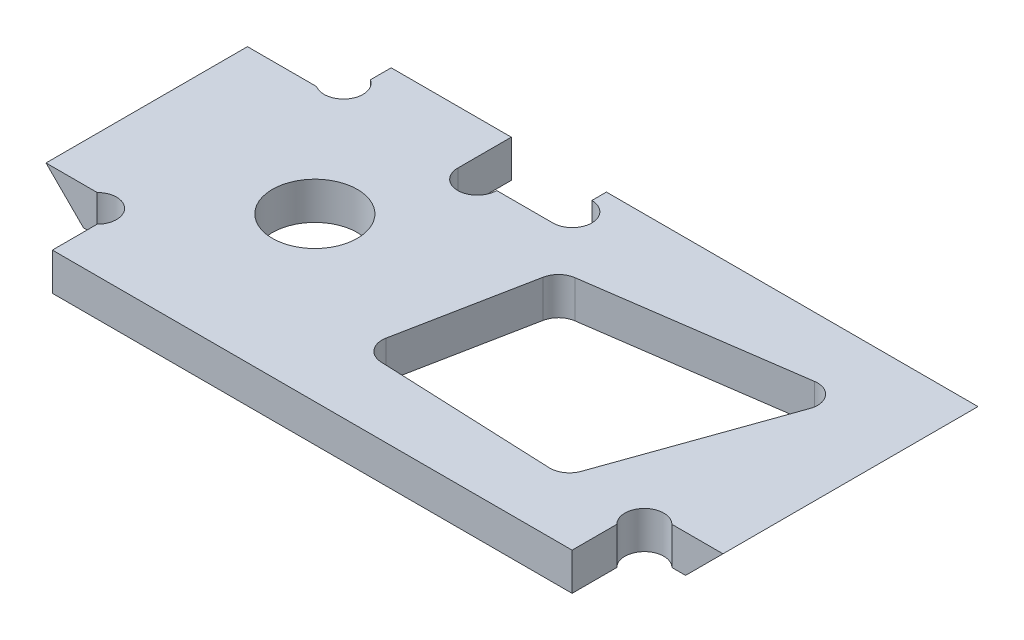
ISO-10303-21;
HEADER;
FILE_DESCRIPTION(('STEP AP214'),'2;1');
FILE_NAME('part.step','',(''),(''),'','','');
FILE_SCHEMA(('AUTOMOTIVE_DESIGN { 1 0 10303 214 1 1 1 1 }'));
ENDSEC;
DATA;
#1=APPLICATION_CONTEXT('core data for automotive mechanical design processes');
#2=APPLICATION_PROTOCOL_DEFINITION('international standard','automotive_design',2000,#1);
#3=PRODUCT_CONTEXT('',#1,'mechanical');
#4=PRODUCT('Part','Part','',(#3));
#5=PRODUCT_RELATED_PRODUCT_CATEGORY('part','',(#4));
#6=PRODUCT_DEFINITION_FORMATION('','',#4);
#7=PRODUCT_DEFINITION_CONTEXT('part definition',#1,'design');
#8=PRODUCT_DEFINITION('design','',#6,#7);
#9=PRODUCT_DEFINITION_SHAPE('','',#8);
#10=(LENGTH_UNIT() NAMED_UNIT(*) SI_UNIT(.MILLI.,.METRE.));
#11=(NAMED_UNIT(*) PLANE_ANGLE_UNIT() SI_UNIT($,.RADIAN.));
#12=(NAMED_UNIT(*) SI_UNIT($,.STERADIAN.) SOLID_ANGLE_UNIT());
#13=UNCERTAINTY_MEASURE_WITH_UNIT(LENGTH_MEASURE(1.E-05),#10,'distance_accuracy_value','');
#14=(GEOMETRIC_REPRESENTATION_CONTEXT(3) GLOBAL_UNCERTAINTY_ASSIGNED_CONTEXT((#13)) GLOBAL_UNIT_ASSIGNED_CONTEXT((#10,
#11,#12)) REPRESENTATION_CONTEXT('',''));
#15=CARTESIAN_POINT('',(0.,0.,0.));
#16=DIRECTION('',(0.,0.,1.));
#17=DIRECTION('',(1.,0.,0.));
#18=AXIS2_PLACEMENT_3D('',#15,#16,#17);
#19=CARTESIAN_POINT('',(-114.808,12.7,-77.1308478006368));
#20=DIRECTION('',(0.,0.,1.));
#21=DIRECTION('',(1.,0.,0.));
#22=AXIS2_PLACEMENT_3D('',#19,#20,#21);
#23=PLANE('',#22);
#24=DIRECTION('',(-1.,0.,0.));
#25=VECTOR('',#24,1.);
#26=CARTESIAN_POINT('',(-114.808,0.,-77.1308478006368));
#27=LINE('',#26,#25);
#28=CARTESIAN_POINT('',(102.108,0.,-77.1308478006368));
#29=VERTEX_POINT('',#28);
#30=CARTESIAN_POINT('',(-11.2199686031738,0.,-77.1308478006368));
#31=VERTEX_POINT('',#30);
#32=EDGE_CURVE('E413',#29,#31,#27,.T.);
#33=ORIENTED_EDGE('',*,*,#32,.T.);
#34=DIRECTION('',(0.,-1.,0.));
#35=VECTOR('',#34,1.);
#36=CARTESIAN_POINT('',(-11.2199686031738,12.7,-77.1308478006368));
#37=LINE('',#36,#35);
#38=CARTESIAN_POINT('',(-11.2199686031738,12.7,-77.1308478006368));
#39=VERTEX_POINT('',#38);
#40=EDGE_CURVE('E268',#39,#31,#37,.T.);
#41=ORIENTED_EDGE('',*,*,#40,.F.);
#42=DIRECTION('',(-1.,0.,0.));
#43=VECTOR('',#42,1.);
#44=CARTESIAN_POINT('',(-114.808,12.7,-77.1308478006368));
#45=LINE('',#44,#43);
#46=CARTESIAN_POINT('',(114.808,12.7,-77.1308478006368));
#47=VERTEX_POINT('',#46);
#48=EDGE_CURVE('E419',#47,#39,#45,.T.);
#49=ORIENTED_EDGE('',*,*,#48,.F.);
#50=DIRECTION('',(0.707106781186549,0.707106781186546,0.));
#51=VECTOR('',#50,1.);
#52=CARTESIAN_POINT('',(-4.02455846426619E-13,-102.108,-77.1308478006368));
#53=LINE('',#52,#51);
#54=EDGE_CURVE('E422',#47,#29,#53,.F.);
#55=ORIENTED_EDGE('',*,*,#54,.T.);
#56=EDGE_LOOP('',(#33,#41,#49,#55));
#57=FACE_BOUND('',#56,.T.);
#58=ADVANCED_FACE('F39',(#57),#23,.F.);
#59=CARTESIAN_POINT('',(-114.808,12.7,-77.1308478006368));
#60=DIRECTION('',(-0.707106781186546,-0.707106781186549,0.));
#61=DIRECTION('',(0.707106781186549,-0.707106781186546,0.));
#62=AXIS2_PLACEMENT_3D('',#59,#60,#61);
#63=PLANE('',#62);
#64=DIRECTION('',(0.,0.,1.));
#65=VECTOR('',#64,1.);
#66=CARTESIAN_POINT('',(-114.808,12.7,-77.1308478006368));
#67=LINE('',#66,#65);
#68=CARTESIAN_POINT('',(-114.808,12.7,-58.9698478006368));
#69=VERTEX_POINT('',#68);
#70=CARTESIAN_POINT('',(-114.808,12.7,9.35615219936411));
#71=VERTEX_POINT('',#70);
#72=EDGE_CURVE('E409',#69,#71,#67,.T.);
#73=ORIENTED_EDGE('',*,*,#72,.F.);
#74=DIRECTION('',(-0.707106781186549,0.707106781186546,0.));
#75=VECTOR('',#74,1.);
#76=CARTESIAN_POINT('',(-114.808,12.7,-58.9698478006368));
#77=LINE('',#76,#75);
#78=CARTESIAN_POINT('',(-102.108,0.,-58.9698478006368));
#79=VERTEX_POINT('',#78);
#80=EDGE_CURVE('E405',#69,#79,#77,.F.);
#81=ORIENTED_EDGE('',*,*,#80,.T.);
#82=DIRECTION('',(0.,0.,-1.));
#83=VECTOR('',#82,1.);
#84=CARTESIAN_POINT('',(-102.108,0.,-77.1308478006368));
#85=LINE('',#84,#83);
#86=CARTESIAN_POINT('',(-102.108,0.,9.35615219936411));
#87=VERTEX_POINT('',#86);
#88=EDGE_CURVE('E408',#79,#87,#85,.F.);
#89=ORIENTED_EDGE('',*,*,#88,.T.);
#90=DIRECTION('',(0.707106781186549,-0.707106781186546,0.));
#91=VECTOR('',#90,1.);
#92=CARTESIAN_POINT('',(-114.808,12.7,9.35615219936411));
#93=LINE('',#92,#91);
#94=EDGE_CURVE('E396',#87,#71,#93,.F.);
#95=ORIENTED_EDGE('',*,*,#94,.T.);
#96=EDGE_LOOP('',(#73,#81,#89,#95));
#97=FACE_BOUND('',#96,.T.);
#98=ADVANCED_FACE('F473',(#97),#63,.T.);
#99=CARTESIAN_POINT('',(-114.808,12.7,33.8671521993641));
#100=DIRECTION('',(0.,0.,-1.));
#101=DIRECTION('',(-1.,0.,0.));
#102=AXIS2_PLACEMENT_3D('',#99,#100,#101);
#103=PLANE('',#102);
#104=DIRECTION('',(1.,0.,0.));
#105=VECTOR('',#104,1.);
#106=CARTESIAN_POINT('',(-114.808,0.,33.8671521993641));
#107=LINE('',#106,#105);
#108=CARTESIAN_POINT('',(-88.138,0.,33.8671521993641));
#109=VERTEX_POINT('',#108);
#110=CARTESIAN_POINT('',(88.138,0.,33.8671521993641));
#111=VERTEX_POINT('',#110);
#112=EDGE_CURVE('E423',#109,#111,#107,.T.);
#113=ORIENTED_EDGE('',*,*,#112,.T.);
#114=DIRECTION('',(0.,1.,0.));
#115=VECTOR('',#114,1.);
#116=CARTESIAN_POINT('',(88.138,0.,33.8671521993641));
#117=LINE('',#116,#115);
#118=CARTESIAN_POINT('',(88.138,12.7,33.8671521993641));
#119=VERTEX_POINT('',#118);
#120=EDGE_CURVE('E337',#111,#119,#117,.T.);
#121=ORIENTED_EDGE('',*,*,#120,.T.);
#122=DIRECTION('',(1.,0.,0.));
#123=VECTOR('',#122,1.);
#124=CARTESIAN_POINT('',(-114.808,12.7,33.8671521993641));
#125=LINE('',#124,#123);
#126=CARTESIAN_POINT('',(-88.138,12.7,33.8671521993641));
#127=VERTEX_POINT('',#126);
#128=EDGE_CURVE('E412',#127,#119,#125,.T.);
#129=ORIENTED_EDGE('',*,*,#128,.F.);
#130=DIRECTION('',(0.,1.,0.));
#131=VECTOR('',#130,1.);
#132=CARTESIAN_POINT('',(-88.138,0.,33.8671521993641));
#133=LINE('',#132,#131);
#134=EDGE_CURVE('E387',#109,#127,#133,.T.);
#135=ORIENTED_EDGE('',*,*,#134,.F.);
#136=EDGE_LOOP('',(#113,#121,#129,#135));
#137=FACE_BOUND('',#136,.T.);
#138=ADVANCED_FACE('F458',(#137),#103,.F.);
#139=CARTESIAN_POINT('',(114.808,12.7,-77.1308478006368));
#140=DIRECTION('',(0.707106781186546,-0.707106781186549,0.));
#141=DIRECTION('',(0.707106781186549,0.707106781186546,0.));
#142=AXIS2_PLACEMENT_3D('',#139,#140,#141);
#143=PLANE('',#142);
#144=DIRECTION('',(0.,0.,-1.));
#145=VECTOR('',#144,1.);
#146=CARTESIAN_POINT('',(114.808,12.7,-77.1308478006368));
#147=LINE('',#146,#145);
#148=CARTESIAN_POINT('',(114.808,12.7,9.35615219936409));
#149=VERTEX_POINT('',#148);
#150=EDGE_CURVE('E416',#149,#47,#147,.T.);
#151=ORIENTED_EDGE('',*,*,#150,.F.);
#152=DIRECTION('',(0.707106781186549,0.707106781186546,0.));
#153=VECTOR('',#152,1.);
#154=CARTESIAN_POINT('',(114.808,12.7,9.35615219936409));
#155=LINE('',#154,#153);
#156=CARTESIAN_POINT('',(102.108,0.,9.35615219936409));
#157=VERTEX_POINT('',#156);
#158=EDGE_CURVE('E402',#149,#157,#155,.F.);
#159=ORIENTED_EDGE('',*,*,#158,.T.);
#160=DIRECTION('',(0.,0.,1.));
#161=VECTOR('',#160,1.);
#162=CARTESIAN_POINT('',(102.108,0.,-77.1308478006368));
#163=LINE('',#162,#161);
#164=EDGE_CURVE('E426',#157,#29,#163,.F.);
#165=ORIENTED_EDGE('',*,*,#164,.T.);
#166=ORIENTED_EDGE('',*,*,#54,.F.);
#167=EDGE_LOOP('',(#151,#159,#165,#166));
#168=FACE_BOUND('',#167,.T.);
#169=ADVANCED_FACE('F41',(#168),#143,.T.);
#170=CARTESIAN_POINT('',(-43.4779686031738,12.7,-77.1308478006368));
#171=VERTEX_POINT('',#170);
#172=CARTESIAN_POINT('',(-84.2245851126541,12.7,-77.1308478006368));
#173=VERTEX_POINT('',#172);
#174=EDGE_CURVE('E418',#171,#173,#45,.T.);
#175=ORIENTED_EDGE('',*,*,#174,.F.);
#176=DIRECTION('',(0.,-1.,0.));
#177=VECTOR('',#176,1.);
#178=CARTESIAN_POINT('',(-43.4779686031738,12.7,-77.1308478006368));
#179=LINE('',#178,#177);
#180=CARTESIAN_POINT('',(-43.4779686031738,0.,-77.1308478006368));
#181=VERTEX_POINT('',#180);
#182=EDGE_CURVE('E224',#171,#181,#179,.T.);
#183=ORIENTED_EDGE('',*,*,#182,.T.);
#184=CARTESIAN_POINT('',(-84.2245851126541,0.,-77.1308478006368));
#185=VERTEX_POINT('',#184);
#186=EDGE_CURVE('E429',#181,#185,#27,.T.);
#187=ORIENTED_EDGE('',*,*,#186,.T.);
#188=DIRECTION('',(0.,1.,0.));
#189=VECTOR('',#188,1.);
#190=CARTESIAN_POINT('',(-84.2245851126541,0.,-77.1308478006368));
#191=LINE('',#190,#189);
#192=EDGE_CURVE('E320',#185,#173,#191,.T.);
#193=ORIENTED_EDGE('',*,*,#192,.T.);
#194=EDGE_LOOP('',(#175,#183,#187,#193));
#195=FACE_BOUND('',#194,.T.);
#196=ADVANCED_FACE('F488',(#195),#23,.F.);
#197=CARTESIAN_POINT('',(0.,12.7,0.));
#198=DIRECTION('',(0.,1.,0.));
#199=DIRECTION('',(0.,0.,1.));
#200=AXIS2_PLACEMENT_3D('',#197,#198,#199);
#201=PLANE('',#200);
#202=CARTESIAN_POINT('',(-54.2628101997534,12.7,-21.2860980461469));
#203=DIRECTION('',(0.,-1.,0.));
#204=DIRECTION('',(0.,0.,-1.));
#205=AXIS2_PLACEMENT_3D('',#202,#203,#204);
#206=CIRCLE('',#205,14.4061242384659);
#207=CARTESIAN_POINT('',(-54.2628101997534,12.7,-35.6922222846128));
#208=VERTEX_POINT('',#207);
#209=EDGE_CURVE('E255',#208,#208,#206,.T.);
#210=ORIENTED_EDGE('',*,*,#209,.T.);
#211=EDGE_LOOP('',(#210));
#212=FACE_BOUND('',#211,.T.);
#213=DIRECTION('',(0.,0.,1.));
#214=VECTOR('',#213,1.);
#215=CARTESIAN_POINT('',(-11.2199686031738,12.7,-77.1308478006368));
#216=LINE('',#215,#214);
#217=CARTESIAN_POINT('',(-11.2199686031738,12.7,-72.1778478006368));
#218=VERTEX_POINT('',#217);
#219=EDGE_CURVE('E233',#39,#218,#216,.T.);
#220=ORIENTED_EDGE('',*,*,#219,.T.);
#221=CARTESIAN_POINT('',(-11.2199686031738,12.7,-65.5738478006368));
#222=DIRECTION('',(0.,-1.,0.));
#223=DIRECTION('',(0.,0.,1.));
#224=AXIS2_PLACEMENT_3D('',#221,#222,#223);
#225=CIRCLE('',#224,6.604);
#226=CARTESIAN_POINT('',(-11.2199686031738,12.7,-58.9698478006368));
#227=VERTEX_POINT('',#226);
#228=EDGE_CURVE('E250',#218,#227,#225,.T.);
#229=ORIENTED_EDGE('',*,*,#228,.T.);
#230=DIRECTION('',(-1.,0.,0.));
#231=VECTOR('',#230,1.);
#232=CARTESIAN_POINT('',(-11.2199686031738,12.7,-58.9698478006368));
#233=LINE('',#232,#231);
#234=CARTESIAN_POINT('',(-30.2699686031738,12.7,-58.9698478006368));
#235=VERTEX_POINT('',#234);
#236=EDGE_CURVE('E225',#227,#235,#233,.T.);
#237=ORIENTED_EDGE('',*,*,#236,.T.);
#238=CARTESIAN_POINT('',(-36.8739686031738,12.7,-58.9698478006368));
#239=DIRECTION('',(0.,-1.,0.));
#240=DIRECTION('',(0.,0.,1.));
#241=AXIS2_PLACEMENT_3D('',#238,#239,#240);
#242=CIRCLE('',#241,6.60400000000001);
#243=CARTESIAN_POINT('',(-43.4779686031738,12.7,-58.9698478006368));
#244=VERTEX_POINT('',#243);
#245=EDGE_CURVE('E220',#235,#244,#242,.T.);
#246=ORIENTED_EDGE('',*,*,#245,.T.);
#247=DIRECTION('',(0.,0.,-1.));
#248=VECTOR('',#247,1.);
#249=CARTESIAN_POINT('',(-43.4779686031738,12.7,-77.1308478006368));
#250=LINE('',#249,#248);
#251=EDGE_CURVE('E228',#244,#171,#250,.T.);
#252=ORIENTED_EDGE('',*,*,#251,.T.);
#253=ORIENTED_EDGE('',*,*,#174,.T.);
#254=DIRECTION('',(0.,0.,-1.));
#255=VECTOR('',#254,1.);
#256=CARTESIAN_POINT('',(-84.2245851126541,12.7,-70.0995701691418));
#257=LINE('',#256,#255);
#258=CARTESIAN_POINT('',(-84.2245851126541,12.7,-70.0995701691418));
#259=VERTEX_POINT('',#258);
#260=EDGE_CURVE('E364',#259,#173,#257,.T.);
#261=ORIENTED_EDGE('',*,*,#260,.F.);
#262=CARTESIAN_POINT('',(-87.7805851126541,12.7,-64.5347089848893));
#263=DIRECTION('',(0.,1.,0.));
#264=DIRECTION('',(0.,0.,1.));
#265=AXIS2_PLACEMENT_3D('',#262,#263,#264);
#266=CIRCLE('',#265,6.60399999999999);
#267=CARTESIAN_POINT('',(-91.3365851126541,12.7,-58.9698478006368));
#268=VERTEX_POINT('',#267);
#269=EDGE_CURVE('E367',#268,#259,#266,.T.);
#270=ORIENTED_EDGE('',*,*,#269,.F.);
#271=DIRECTION('',(1.,0.,0.));
#272=VECTOR('',#271,1.);
#273=CARTESIAN_POINT('',(-114.808,12.7,-58.9698478006368));
#274=LINE('',#273,#272);
#275=EDGE_CURVE('E342',#69,#268,#274,.T.);
#276=ORIENTED_EDGE('',*,*,#275,.F.);
#277=ORIENTED_EDGE('',*,*,#72,.T.);
#278=DIRECTION('',(-1.,0.,0.));
#279=VECTOR('',#278,1.);
#280=CARTESIAN_POINT('',(-114.808,12.7,9.35615219936411));
#281=LINE('',#280,#279);
#282=CARTESIAN_POINT('',(-97.4774663659119,12.7,9.35615219936411));
#283=VERTEX_POINT('',#282);
#284=EDGE_CURVE('E381',#283,#71,#281,.T.);
#285=ORIENTED_EDGE('',*,*,#284,.F.);
#286=CARTESIAN_POINT('',(-92.807733182956,12.7,14.0258853823201));
#287=DIRECTION('',(0.,1.,0.));
#288=DIRECTION('',(0.,0.,1.));
#289=AXIS2_PLACEMENT_3D('',#286,#287,#288);
#290=CIRCLE('',#289,6.60400000000001);
#291=CARTESIAN_POINT('',(-88.138,12.7,18.695618565276));
#292=VERTEX_POINT('',#291);
#293=EDGE_CURVE('E390',#292,#283,#290,.T.);
#294=ORIENTED_EDGE('',*,*,#293,.F.);
#295=DIRECTION('',(0.,0.,-1.));
#296=VECTOR('',#295,1.);
#297=CARTESIAN_POINT('',(-88.138,12.7,18.695618565276));
#298=LINE('',#297,#296);
#299=EDGE_CURVE('E352',#127,#292,#298,.T.);
#300=ORIENTED_EDGE('',*,*,#299,.F.);
#301=ORIENTED_EDGE('',*,*,#128,.T.);
#302=DIRECTION('',(0.,0.,1.));
#303=VECTOR('',#302,1.);
#304=CARTESIAN_POINT('',(88.138,12.7,18.695618565276));
#305=LINE('',#304,#303);
#306=CARTESIAN_POINT('',(88.138,12.7,18.695618565276));
#307=VERTEX_POINT('',#306);
#308=EDGE_CURVE('E346',#307,#119,#305,.T.);
#309=ORIENTED_EDGE('',*,*,#308,.F.);
#310=CARTESIAN_POINT('',(92.807733182956,12.7,14.02588538232));
#311=DIRECTION('',(0.,1.,0.));
#312=DIRECTION('',(0.,0.,-1.));
#313=AXIS2_PLACEMENT_3D('',#310,#311,#312);
#314=CIRCLE('',#313,6.60400000000001);
#315=CARTESIAN_POINT('',(97.477466365912,12.7,9.35615219936409));
#316=VERTEX_POINT('',#315);
#317=EDGE_CURVE('E349',#316,#307,#314,.T.);
#318=ORIENTED_EDGE('',*,*,#317,.F.);
#319=DIRECTION('',(-1.,0.,0.));
#320=VECTOR('',#319,1.);
#321=CARTESIAN_POINT('',(114.808,12.7,9.35615219936409));
#322=LINE('',#321,#320);
#323=EDGE_CURVE('E343',#149,#316,#322,.T.);
#324=ORIENTED_EDGE('',*,*,#323,.F.);
#325=ORIENTED_EDGE('',*,*,#150,.T.);
#326=ORIENTED_EDGE('',*,*,#48,.T.);
#327=EDGE_LOOP('',(#220,#229,#237,#246,#252,#253,#261,#270,#276,#277,#285,#294,#300,#301,#309,
#318,#324,#325,#326));
#328=FACE_BOUND('',#327,.T.);
#329=CARTESIAN_POINT('',(60.3247311954267,12.7,6.9491543096018));
#330=DIRECTION('',(0.,1.,0.));
#331=DIRECTION('',(0.,0.,1.));
#332=AXIS2_PLACEMENT_3D('',#329,#330,#331);
#333=CIRCLE('',#332,6.604);
#334=CARTESIAN_POINT('',(60.0432354642127,12.7,13.5471521993641));
#335=VERTEX_POINT('',#334);
#336=CARTESIAN_POINT('',(66.548,12.7,9.15907317372891));
#337=VERTEX_POINT('',#336);
#338=EDGE_CURVE('E62',#335,#337,#333,.T.);
#339=ORIENTED_EDGE('',*,*,#338,.F.);
#340=DIRECTION('',(0.999091140182062,0.,0.0426250350112056));
#341=VECTOR('',#340,1.);
#342=CARTESIAN_POINT('',(0.508000000000008,12.7,11.0071521993641));
#343=LINE('',#342,#341);
#344=CARTESIAN_POINT('',(0.508000000000008,12.7,11.0071521993641));
#345=VERTEX_POINT('',#344);
#346=EDGE_CURVE('E275',#345,#335,#343,.T.);
#347=ORIENTED_EDGE('',*,*,#346,.F.);
#348=CARTESIAN_POINT('',(0.78949573121401,12.7,4.4091543096018));
#349=DIRECTION('',(0.,1.,0.));
#350=DIRECTION('',(0.,0.,-1.));
#351=AXIS2_PLACEMENT_3D('',#348,#349,#350);
#352=CIRCLE('',#351,6.604);
#353=CARTESIAN_POINT('',(-5.69085349936928,12.7,3.13719131891438));
#354=VERTEX_POINT('',#353);
#355=EDGE_CURVE('E313',#354,#345,#352,.T.);
#356=ORIENTED_EDGE('',*,*,#355,.F.);
#357=DIRECTION('',(-0.192604934992039,0.,0.981276382583782));
#358=VECTOR('',#357,1.);
#359=CARTESIAN_POINT('',(3.04799999999999,12.7,-41.3851909873601));
#360=LINE('',#359,#358);
#361=CARTESIAN_POINT('',(3.04799999999999,12.7,-41.3851909873601));
#362=VERTEX_POINT('',#361);
#363=EDGE_CURVE('E310',#362,#354,#360,.T.);
#364=ORIENTED_EDGE('',*,*,#363,.F.);
#365=CARTESIAN_POINT('',(9.52834923058329,12.7,-40.1132279966727));
#366=DIRECTION('',(0.,1.,0.));
#367=DIRECTION('',(0.,0.,1.));
#368=AXIS2_PLACEMENT_3D('',#365,#366,#367);
#369=CIRCLE('',#368,6.604);
#370=CARTESIAN_POINT('',(8.59435602995742,12.7,-46.6508478006368));
#371=VERTEX_POINT('',#370);
#372=EDGE_CURVE('E307',#371,#362,#369,.T.);
#373=ORIENTED_EDGE('',*,*,#372,.F.);
#374=DIRECTION('',(-0.989948486366472,0.,0.141428407120816));
#375=VECTOR('',#374,1.);
#376=CARTESIAN_POINT('',(79.7107379948008,12.7,-56.8108478006368));
#377=LINE('',#376,#375);
#378=CARTESIAN_POINT('',(79.7107379948008,12.7,-56.8108478006368));
#379=VERTEX_POINT('',#378);
#380=EDGE_CURVE('E304',#379,#371,#377,.T.);
#381=ORIENTED_EDGE('',*,*,#380,.F.);
#382=CARTESIAN_POINT('',(80.6447311954267,12.7,-50.2732279966727));
#383=DIRECTION('',(0.,1.,0.));
#384=DIRECTION('',(0.,0.,1.));
#385=AXIS2_PLACEMENT_3D('',#382,#383,#384);
#386=CIRCLE('',#385,6.604);
#387=CARTESIAN_POINT('',(86.868,12.7,-48.0633091325455));
#388=VERTEX_POINT('',#387);
#389=EDGE_CURVE('E301',#388,#379,#386,.T.);
#390=ORIENTED_EDGE('',*,*,#389,.F.);
#391=DIRECTION('',(0.334633383423245,0.,-0.942348395604678));
#392=VECTOR('',#391,1.);
#393=CARTESIAN_POINT('',(66.548,12.7,9.15907317372891));
#394=LINE('',#393,#392);
#395=EDGE_CURVE('E298',#337,#388,#394,.T.);
#396=ORIENTED_EDGE('',*,*,#395,.F.);
#397=EDGE_LOOP('',(#339,#347,#356,#364,#373,#381,#390,#396));
#398=FACE_BOUND('',#397,.T.);
#399=ADVANCED_FACE('F236',(#212,#328,#398),#201,.T.);
#400=CARTESIAN_POINT('',(0.,0.,0.));
#401=DIRECTION('',(0.,1.,0.));
#402=DIRECTION('',(0.,0.,1.));
#403=AXIS2_PLACEMENT_3D('',#400,#401,#402);
#404=PLANE('',#403);
#405=CARTESIAN_POINT('',(-54.2628101997534,0.,-21.2860980461469));
#406=DIRECTION('',(0.,-1.,0.));
#407=DIRECTION('',(0.,0.,-1.));
#408=AXIS2_PLACEMENT_3D('',#405,#406,#407);
#409=CIRCLE('',#408,14.4061242384659);
#410=CARTESIAN_POINT('',(-54.2628101997534,0.,-35.6922222846128));
#411=VERTEX_POINT('',#410);
#412=EDGE_CURVE('E246',#411,#411,#409,.T.);
#413=ORIENTED_EDGE('',*,*,#412,.F.);
#414=EDGE_LOOP('',(#413));
#415=FACE_BOUND('',#414,.T.);
#416=DIRECTION('',(0.999091140182062,0.,0.0426250350112056));
#417=VECTOR('',#416,1.);
#418=CARTESIAN_POINT('',(0.508000000000008,0.,11.0071521993641));
#419=LINE('',#418,#417);
#420=CARTESIAN_POINT('',(0.508000000000008,0.,11.0071521993641));
#421=VERTEX_POINT('',#420);
#422=CARTESIAN_POINT('',(60.0432354642127,0.,13.5471521993641));
#423=VERTEX_POINT('',#422);
#424=EDGE_CURVE('E293',#421,#423,#419,.T.);
#425=ORIENTED_EDGE('',*,*,#424,.T.);
#426=CARTESIAN_POINT('',(60.3247311954267,0.,6.9491543096018));
#427=DIRECTION('',(0.,1.,0.));
#428=DIRECTION('',(0.,0.,1.));
#429=AXIS2_PLACEMENT_3D('',#426,#427,#428);
#430=CIRCLE('',#429,6.604);
#431=CARTESIAN_POINT('',(66.548,0.,9.15907317372891));
#432=VERTEX_POINT('',#431);
#433=EDGE_CURVE('E271',#423,#432,#430,.T.);
#434=ORIENTED_EDGE('',*,*,#433,.T.);
#435=DIRECTION('',(0.334633383423245,0.,-0.942348395604678));
#436=VECTOR('',#435,1.);
#437=CARTESIAN_POINT('',(66.548,0.,9.15907317372891));
#438=LINE('',#437,#436);
#439=CARTESIAN_POINT('',(86.868,0.,-48.0633091325455));
#440=VERTEX_POINT('',#439);
#441=EDGE_CURVE('E274',#432,#440,#438,.T.);
#442=ORIENTED_EDGE('',*,*,#441,.T.);
#443=CARTESIAN_POINT('',(80.6447311954267,0.,-50.2732279966727));
#444=DIRECTION('',(0.,1.,0.));
#445=DIRECTION('',(0.,0.,1.));
#446=AXIS2_PLACEMENT_3D('',#443,#444,#445);
#447=CIRCLE('',#446,6.604);
#448=CARTESIAN_POINT('',(79.7107379948008,0.,-56.8108478006368));
#449=VERTEX_POINT('',#448);
#450=EDGE_CURVE('E278',#440,#449,#447,.T.);
#451=ORIENTED_EDGE('',*,*,#450,.T.);
#452=DIRECTION('',(-0.989948486366472,0.,0.141428407120816));
#453=VECTOR('',#452,1.);
#454=CARTESIAN_POINT('',(79.7107379948008,0.,-56.8108478006368));
#455=LINE('',#454,#453);
#456=CARTESIAN_POINT('',(8.59435602995742,0.,-46.6508478006368));
#457=VERTEX_POINT('',#456);
#458=EDGE_CURVE('E281',#449,#457,#455,.T.);
#459=ORIENTED_EDGE('',*,*,#458,.T.);
#460=CARTESIAN_POINT('',(9.52834923058329,0.,-40.1132279966727));
#461=DIRECTION('',(0.,1.,0.));
#462=DIRECTION('',(0.,0.,1.));
#463=AXIS2_PLACEMENT_3D('',#460,#461,#462);
#464=CIRCLE('',#463,6.604);
#465=CARTESIAN_POINT('',(3.04799999999999,0.,-41.3851909873601));
#466=VERTEX_POINT('',#465);
#467=EDGE_CURVE('E284',#457,#466,#464,.T.);
#468=ORIENTED_EDGE('',*,*,#467,.T.);
#469=DIRECTION('',(-0.192604934992039,0.,0.981276382583782));
#470=VECTOR('',#469,1.);
#471=CARTESIAN_POINT('',(3.04799999999999,0.,-41.3851909873601));
#472=LINE('',#471,#470);
#473=CARTESIAN_POINT('',(-5.69085349936928,0.,3.13719131891438));
#474=VERTEX_POINT('',#473);
#475=EDGE_CURVE('E287',#466,#474,#472,.T.);
#476=ORIENTED_EDGE('',*,*,#475,.T.);
#477=CARTESIAN_POINT('',(0.78949573121401,0.,4.4091543096018));
#478=DIRECTION('',(0.,1.,0.));
#479=DIRECTION('',(0.,0.,-1.));
#480=AXIS2_PLACEMENT_3D('',#477,#478,#479);
#481=CIRCLE('',#480,6.604);
#482=EDGE_CURVE('E290',#474,#421,#481,.T.);
#483=ORIENTED_EDGE('',*,*,#482,.T.);
#484=EDGE_LOOP('',(#425,#434,#442,#451,#459,#468,#476,#483));
#485=FACE_BOUND('',#484,.T.);
#486=CARTESIAN_POINT('',(-11.2199686031738,0.,-65.5738478006368));
#487=DIRECTION('',(0.,-1.,0.));
#488=DIRECTION('',(0.,0.,1.));
#489=AXIS2_PLACEMENT_3D('',#486,#487,#488);
#490=CIRCLE('',#489,6.604);
#491=CARTESIAN_POINT('',(-11.2199686031738,0.,-72.1778478006368));
#492=VERTEX_POINT('',#491);
#493=CARTESIAN_POINT('',(-11.2199686031738,0.,-58.9698478006368));
#494=VERTEX_POINT('',#493);
#495=EDGE_CURVE('E243',#492,#494,#490,.T.);
#496=ORIENTED_EDGE('',*,*,#495,.F.);
#497=DIRECTION('',(0.,0.,1.));
#498=VECTOR('',#497,1.);
#499=CARTESIAN_POINT('',(-11.2199686031738,0.,-77.1308478006368));
#500=LINE('',#499,#498);
#501=EDGE_CURVE('E257',#31,#492,#500,.T.);
#502=ORIENTED_EDGE('',*,*,#501,.F.);
#503=ORIENTED_EDGE('',*,*,#32,.F.);
#504=ORIENTED_EDGE('',*,*,#164,.F.);
#505=DIRECTION('',(-1.,0.,0.));
#506=VECTOR('',#505,1.);
#507=CARTESIAN_POINT('',(0.,0.,9.3561521993641));
#508=LINE('',#507,#506);
#509=CARTESIAN_POINT('',(97.477466365912,0.,9.35615219936409));
#510=VERTEX_POINT('',#509);
#511=EDGE_CURVE('E47',#157,#510,#508,.T.);
#512=ORIENTED_EDGE('',*,*,#511,.T.);
#513=CARTESIAN_POINT('',(92.807733182956,0.,14.02588538232));
#514=DIRECTION('',(0.,1.,0.));
#515=DIRECTION('',(0.,0.,-1.));
#516=AXIS2_PLACEMENT_3D('',#513,#514,#515);
#517=CIRCLE('',#516,6.60400000000001);
#518=CARTESIAN_POINT('',(88.138,0.,18.695618565276));
#519=VERTEX_POINT('',#518);
#520=EDGE_CURVE('E347',#510,#519,#517,.T.);
#521=ORIENTED_EDGE('',*,*,#520,.T.);
#522=DIRECTION('',(0.,0.,1.));
#523=VECTOR('',#522,1.);
#524=CARTESIAN_POINT('',(88.138,0.,18.695618565276));
#525=LINE('',#524,#523);
#526=EDGE_CURVE('E336',#519,#111,#525,.T.);
#527=ORIENTED_EDGE('',*,*,#526,.T.);
#528=ORIENTED_EDGE('',*,*,#112,.F.);
#529=DIRECTION('',(0.,0.,-1.));
#530=VECTOR('',#529,1.);
#531=CARTESIAN_POINT('',(-88.138,0.,18.695618565276));
#532=LINE('',#531,#530);
#533=CARTESIAN_POINT('',(-88.138,0.,18.695618565276));
#534=VERTEX_POINT('',#533);
#535=EDGE_CURVE('E377',#109,#534,#532,.T.);
#536=ORIENTED_EDGE('',*,*,#535,.T.);
#537=CARTESIAN_POINT('',(-92.807733182956,0.,14.0258853823201));
#538=DIRECTION('',(0.,1.,0.));
#539=DIRECTION('',(0.,0.,1.));
#540=AXIS2_PLACEMENT_3D('',#537,#538,#539);
#541=CIRCLE('',#540,6.60400000000001);
#542=CARTESIAN_POINT('',(-97.4774663659119,0.,9.35615219936411));
#543=VERTEX_POINT('',#542);
#544=EDGE_CURVE('E380',#534,#543,#541,.T.);
#545=ORIENTED_EDGE('',*,*,#544,.T.);
#546=DIRECTION('',(-1.,0.,0.));
#547=VECTOR('',#546,1.);
#548=CARTESIAN_POINT('',(-114.808,0.,9.35615219936411));
#549=LINE('',#548,#547);
#550=EDGE_CURVE('E384',#543,#87,#549,.T.);
#551=ORIENTED_EDGE('',*,*,#550,.T.);
#552=ORIENTED_EDGE('',*,*,#88,.F.);
#553=DIRECTION('',(1.,0.,0.));
#554=VECTOR('',#553,1.);
#555=CARTESIAN_POINT('',(0.,0.,-58.9698478006369));
#556=LINE('',#555,#554);
#557=CARTESIAN_POINT('',(-91.3365851126541,0.,-58.9698478006368));
#558=VERTEX_POINT('',#557);
#559=EDGE_CURVE('E11',#79,#558,#556,.T.);
#560=ORIENTED_EDGE('',*,*,#559,.T.);
#561=CARTESIAN_POINT('',(-87.7805851126541,0.,-64.5347089848893));
#562=DIRECTION('',(0.,1.,0.));
#563=DIRECTION('',(0.,0.,1.));
#564=AXIS2_PLACEMENT_3D('',#561,#562,#563);
#565=CIRCLE('',#564,6.60399999999999);
#566=CARTESIAN_POINT('',(-84.2245851126541,0.,-70.0995701691418));
#567=VERTEX_POINT('',#566);
#568=EDGE_CURVE('E368',#558,#567,#565,.T.);
#569=ORIENTED_EDGE('',*,*,#568,.T.);
#570=DIRECTION('',(0.,0.,-1.));
#571=VECTOR('',#570,1.);
#572=CARTESIAN_POINT('',(-84.2245851126541,0.,-70.0995701691418));
#573=LINE('',#572,#571);
#574=EDGE_CURVE('E359',#567,#185,#573,.T.);
#575=ORIENTED_EDGE('',*,*,#574,.T.);
#576=ORIENTED_EDGE('',*,*,#186,.F.);
#577=DIRECTION('',(0.,0.,-1.));
#578=VECTOR('',#577,1.);
#579=CARTESIAN_POINT('',(-43.4779686031738,0.,-77.1308478006368));
#580=LINE('',#579,#578);
#581=CARTESIAN_POINT('',(-43.4779686031738,0.,-58.9698478006368));
#582=VERTEX_POINT('',#581);
#583=EDGE_CURVE('E254',#582,#181,#580,.T.);
#584=ORIENTED_EDGE('',*,*,#583,.F.);
#585=CARTESIAN_POINT('',(-36.8739686031738,0.,-58.9698478006368));
#586=DIRECTION('',(0.,-1.,0.));
#587=DIRECTION('',(0.,0.,1.));
#588=AXIS2_PLACEMENT_3D('',#585,#586,#587);
#589=CIRCLE('',#588,6.60400000000001);
#590=CARTESIAN_POINT('',(-30.2699686031738,0.,-58.9698478006368));
#591=VERTEX_POINT('',#590);
#592=EDGE_CURVE('E54',#591,#582,#589,.T.);
#593=ORIENTED_EDGE('',*,*,#592,.F.);
#594=DIRECTION('',(-1.,0.,0.));
#595=VECTOR('',#594,1.);
#596=CARTESIAN_POINT('',(-11.2199686031738,0.,-58.9698478006368));
#597=LINE('',#596,#595);
#598=EDGE_CURVE('E240',#494,#591,#597,.T.);
#599=ORIENTED_EDGE('',*,*,#598,.F.);
#600=EDGE_LOOP('',(#496,#502,#503,#504,#512,#521,#527,#528,#536,#545,#551,#552,#560,#569,#575,
#576,#584,#593,#599));
#601=FACE_BOUND('',#600,.T.);
#602=ADVANCED_FACE('F438',(#415,#485,#601),#404,.F.);
#603=CARTESIAN_POINT('',(-114.808,0.,9.35615219936411));
#604=DIRECTION('',(0.,0.,-1.));
#605=DIRECTION('',(-1.,0.,0.));
#606=AXIS2_PLACEMENT_3D('',#603,#604,#605);
#607=PLANE('',#606);
#608=ORIENTED_EDGE('',*,*,#550,.F.);
#609=DIRECTION('',(0.,1.,0.));
#610=VECTOR('',#609,1.);
#611=CARTESIAN_POINT('',(-97.4774663659119,0.,9.35615219936411));
#612=LINE('',#611,#610);
#613=EDGE_CURVE('E394',#543,#283,#612,.T.);
#614=ORIENTED_EDGE('',*,*,#613,.T.);
#615=ORIENTED_EDGE('',*,*,#284,.T.);
#616=ORIENTED_EDGE('',*,*,#94,.F.);
#617=EDGE_LOOP('',(#608,#614,#615,#616));
#618=FACE_BOUND('',#617,.T.);
#619=ADVANCED_FACE('F572',(#618),#607,.F.);
#620=CARTESIAN_POINT('',(-92.807733182956,0.,14.0258853823201));
#621=DIRECTION('',(0.,1.,0.));
#622=DIRECTION('',(0.,0.,1.));
#623=AXIS2_PLACEMENT_3D('',#620,#621,#622);
#624=CYLINDRICAL_SURFACE('',#623,6.60400000000001);
#625=ORIENTED_EDGE('',*,*,#293,.T.);
#626=ORIENTED_EDGE('',*,*,#613,.F.);
#627=ORIENTED_EDGE('',*,*,#544,.F.);
#628=DIRECTION('',(0.,1.,0.));
#629=VECTOR('',#628,1.);
#630=CARTESIAN_POINT('',(-88.138,0.,18.695618565276));
#631=LINE('',#630,#629);
#632=EDGE_CURVE('E397',#534,#292,#631,.T.);
#633=ORIENTED_EDGE('',*,*,#632,.T.);
#634=EDGE_LOOP('',(#625,#626,#627,#633));
#635=FACE_BOUND('',#634,.T.);
#636=ADVANCED_FACE('F467',(#635),#624,.F.);
#637=CARTESIAN_POINT('',(-88.138,0.,18.695618565276));
#638=DIRECTION('',(1.,0.,0.));
#639=DIRECTION('',(0.,0.,-1.));
#640=AXIS2_PLACEMENT_3D('',#637,#638,#639);
#641=PLANE('',#640);
#642=ORIENTED_EDGE('',*,*,#299,.T.);
#643=ORIENTED_EDGE('',*,*,#632,.F.);
#644=ORIENTED_EDGE('',*,*,#535,.F.);
#645=ORIENTED_EDGE('',*,*,#134,.T.);
#646=EDGE_LOOP('',(#642,#643,#644,#645));
#647=FACE_BOUND('',#646,.T.);
#648=ADVANCED_FACE('F462',(#647),#641,.F.);
#649=CARTESIAN_POINT('',(114.808,0.,9.35615219936409));
#650=DIRECTION('',(0.,0.,-1.));
#651=DIRECTION('',(-1.,0.,0.));
#652=AXIS2_PLACEMENT_3D('',#649,#650,#651);
#653=PLANE('',#652);
#654=ORIENTED_EDGE('',*,*,#323,.T.);
#655=DIRECTION('',(0.,1.,0.));
#656=VECTOR('',#655,1.);
#657=CARTESIAN_POINT('',(97.477466365912,0.,9.35615219936409));
#658=LINE('',#657,#656);
#659=EDGE_CURVE('E340',#510,#316,#658,.T.);
#660=ORIENTED_EDGE('',*,*,#659,.F.);
#661=ORIENTED_EDGE('',*,*,#511,.F.);
#662=ORIENTED_EDGE('',*,*,#158,.F.);
#663=EDGE_LOOP('',(#654,#660,#661,#662));
#664=FACE_BOUND('',#663,.T.);
#665=ADVANCED_FACE('F442',(#664),#653,.F.);
#666=CARTESIAN_POINT('',(92.807733182956,0.,14.02588538232));
#667=DIRECTION('',(0.,1.,0.));
#668=DIRECTION('',(0.,0.,1.));
#669=AXIS2_PLACEMENT_3D('',#666,#667,#668);
#670=CYLINDRICAL_SURFACE('',#669,6.60400000000001);
#671=ORIENTED_EDGE('',*,*,#317,.T.);
#672=DIRECTION('',(0.,1.,0.));
#673=VECTOR('',#672,1.);
#674=CARTESIAN_POINT('',(88.138,0.,18.695618565276));
#675=LINE('',#674,#673);
#676=EDGE_CURVE('E334',#519,#307,#675,.T.);
#677=ORIENTED_EDGE('',*,*,#676,.F.);
#678=ORIENTED_EDGE('',*,*,#520,.F.);
#679=ORIENTED_EDGE('',*,*,#659,.T.);
#680=EDGE_LOOP('',(#671,#677,#678,#679));
#681=FACE_BOUND('',#680,.T.);
#682=ADVANCED_FACE('F451',(#681),#670,.F.);
#683=CARTESIAN_POINT('',(88.138,0.,18.695618565276));
#684=DIRECTION('',(-1.,0.,0.));
#685=DIRECTION('',(0.,0.,1.));
#686=AXIS2_PLACEMENT_3D('',#683,#684,#685);
#687=PLANE('',#686);
#688=ORIENTED_EDGE('',*,*,#308,.T.);
#689=ORIENTED_EDGE('',*,*,#120,.F.);
#690=ORIENTED_EDGE('',*,*,#526,.F.);
#691=ORIENTED_EDGE('',*,*,#676,.T.);
#692=EDGE_LOOP('',(#688,#689,#690,#691));
#693=FACE_BOUND('',#692,.T.);
#694=ADVANCED_FACE('F454',(#693),#687,.F.);
#695=CARTESIAN_POINT('',(-114.808,0.,-58.9698478006368));
#696=DIRECTION('',(0.,0.,1.));
#697=DIRECTION('',(1.,0.,0.));
#698=AXIS2_PLACEMENT_3D('',#695,#696,#697);
#699=PLANE('',#698);
#700=ORIENTED_EDGE('',*,*,#275,.T.);
#701=DIRECTION('',(0.,1.,0.));
#702=VECTOR('',#701,1.);
#703=CARTESIAN_POINT('',(-91.3365851126541,0.,-58.9698478006368));
#704=LINE('',#703,#702);
#705=EDGE_CURVE('E357',#558,#268,#704,.T.);
#706=ORIENTED_EDGE('',*,*,#705,.F.);
#707=ORIENTED_EDGE('',*,*,#559,.F.);
#708=ORIENTED_EDGE('',*,*,#80,.F.);
#709=EDGE_LOOP('',(#700,#706,#707,#708));
#710=FACE_BOUND('',#709,.T.);
#711=ADVANCED_FACE('F476',(#710),#699,.F.);
#712=CARTESIAN_POINT('',(-84.2245851126541,0.,-70.0995701691418));
#713=DIRECTION('',(1.,0.,0.));
#714=DIRECTION('',(0.,0.,-1.));
#715=AXIS2_PLACEMENT_3D('',#712,#713,#714);
#716=PLANE('',#715);
#717=ORIENTED_EDGE('',*,*,#260,.T.);
#718=ORIENTED_EDGE('',*,*,#192,.F.);
#719=ORIENTED_EDGE('',*,*,#574,.F.);
#720=DIRECTION('',(0.,1.,0.));
#721=VECTOR('',#720,1.);
#722=CARTESIAN_POINT('',(-84.2245851126541,0.,-70.0995701691418));
#723=LINE('',#722,#721);
#724=EDGE_CURVE('E360',#567,#259,#723,.T.);
#725=ORIENTED_EDGE('',*,*,#724,.T.);
#726=EDGE_LOOP('',(#717,#718,#719,#725));
#727=FACE_BOUND('',#726,.T.);
#728=ADVANCED_FACE('F486',(#727),#716,.F.);
#729=CARTESIAN_POINT('',(-87.7805851126541,0.,-64.5347089848893));
#730=DIRECTION('',(0.,1.,0.));
#731=DIRECTION('',(0.,0.,1.));
#732=AXIS2_PLACEMENT_3D('',#729,#730,#731);
#733=CYLINDRICAL_SURFACE('',#732,6.60399999999999);
#734=ORIENTED_EDGE('',*,*,#269,.T.);
#735=ORIENTED_EDGE('',*,*,#724,.F.);
#736=ORIENTED_EDGE('',*,*,#568,.F.);
#737=ORIENTED_EDGE('',*,*,#705,.T.);
#738=EDGE_LOOP('',(#734,#735,#736,#737));
#739=FACE_BOUND('',#738,.T.);
#740=ADVANCED_FACE('F481',(#739),#733,.F.);
#741=CARTESIAN_POINT('',(60.3247311954267,0.,6.9491543096018));
#742=DIRECTION('',(0.,1.,0.));
#743=DIRECTION('',(0.,0.,1.));
#744=AXIS2_PLACEMENT_3D('',#741,#742,#743);
#745=CYLINDRICAL_SURFACE('',#744,6.604);
#746=ORIENTED_EDGE('',*,*,#338,.T.);
#747=DIRECTION('',(0.,1.,0.));
#748=VECTOR('',#747,1.);
#749=CARTESIAN_POINT('',(66.548,0.,9.15907317372891));
#750=LINE('',#749,#748);
#751=EDGE_CURVE('E296',#432,#337,#750,.T.);
#752=ORIENTED_EDGE('',*,*,#751,.F.);
#753=ORIENTED_EDGE('',*,*,#433,.F.);
#754=DIRECTION('',(0.,1.,0.));
#755=VECTOR('',#754,1.);
#756=CARTESIAN_POINT('',(60.0432354642127,0.,13.5471521993641));
#757=LINE('',#756,#755);
#758=EDGE_CURVE('E318',#423,#335,#757,.T.);
#759=ORIENTED_EDGE('',*,*,#758,.T.);
#760=EDGE_LOOP('',(#746,#752,#753,#759));
#761=FACE_BOUND('',#760,.T.);
#762=ADVANCED_FACE('F535',(#761),#745,.F.);
#763=CARTESIAN_POINT('',(0.508000000000008,0.,11.0071521993641));
#764=DIRECTION('',(-0.0426250350112056,0.,0.999091140182062));
#765=DIRECTION('',(0.999091140182063,0.,0.0426250350112056));
#766=AXIS2_PLACEMENT_3D('',#763,#764,#765);
#767=PLANE('',#766);
#768=ORIENTED_EDGE('',*,*,#346,.T.);
#769=ORIENTED_EDGE('',*,*,#758,.F.);
#770=ORIENTED_EDGE('',*,*,#424,.F.);
#771=DIRECTION('',(0.,1.,0.));
#772=VECTOR('',#771,1.);
#773=CARTESIAN_POINT('',(0.508000000000008,0.,11.0071521993641));
#774=LINE('',#773,#772);
#775=EDGE_CURVE('E321',#421,#345,#774,.T.);
#776=ORIENTED_EDGE('',*,*,#775,.T.);
#777=EDGE_LOOP('',(#768,#769,#770,#776));
#778=FACE_BOUND('',#777,.T.);
#779=ADVANCED_FACE('F531',(#778),#767,.F.);
#780=CARTESIAN_POINT('',(0.78949573121401,0.,4.4091543096018));
#781=DIRECTION('',(0.,1.,0.));
#782=DIRECTION('',(0.,0.,1.));
#783=AXIS2_PLACEMENT_3D('',#780,#781,#782);
#784=CYLINDRICAL_SURFACE('',#783,6.604);
#785=ORIENTED_EDGE('',*,*,#355,.T.);
#786=ORIENTED_EDGE('',*,*,#775,.F.);
#787=ORIENTED_EDGE('',*,*,#482,.F.);
#788=DIRECTION('',(0.,1.,0.));
#789=VECTOR('',#788,1.);
#790=CARTESIAN_POINT('',(-5.69085349936928,0.,3.13719131891438));
#791=LINE('',#790,#789);
#792=EDGE_CURVE('E323',#474,#354,#791,.T.);
#793=ORIENTED_EDGE('',*,*,#792,.T.);
#794=EDGE_LOOP('',(#785,#786,#787,#793));
#795=FACE_BOUND('',#794,.T.);
#796=ADVANCED_FACE('F534',(#795),#784,.F.);
#797=CARTESIAN_POINT('',(3.04799999999999,0.,-41.3851909873601));
#798=DIRECTION('',(-0.981276382583782,0.,-0.192604934992039));
#799=DIRECTION('',(-0.192604934992039,0.,0.981276382583782));
#800=AXIS2_PLACEMENT_3D('',#797,#798,#799);
#801=PLANE('',#800);
#802=ORIENTED_EDGE('',*,*,#363,.T.);
#803=ORIENTED_EDGE('',*,*,#792,.F.);
#804=ORIENTED_EDGE('',*,*,#475,.F.);
#805=DIRECTION('',(0.,1.,0.));
#806=VECTOR('',#805,1.);
#807=CARTESIAN_POINT('',(3.04799999999999,0.,-41.3851909873601));
#808=LINE('',#807,#806);
#809=EDGE_CURVE('E325',#466,#362,#808,.T.);
#810=ORIENTED_EDGE('',*,*,#809,.T.);
#811=EDGE_LOOP('',(#802,#803,#804,#810));
#812=FACE_BOUND('',#811,.T.);
#813=ADVANCED_FACE('F539',(#812),#801,.F.);
#814=CARTESIAN_POINT('',(9.52834923058329,0.,-40.1132279966727));
#815=DIRECTION('',(0.,1.,0.));
#816=DIRECTION('',(0.,0.,1.));
#817=AXIS2_PLACEMENT_3D('',#814,#815,#816);
#818=CYLINDRICAL_SURFACE('',#817,6.604);
#819=ORIENTED_EDGE('',*,*,#372,.T.);
#820=ORIENTED_EDGE('',*,*,#809,.F.);
#821=ORIENTED_EDGE('',*,*,#467,.F.);
#822=DIRECTION('',(0.,1.,0.));
#823=VECTOR('',#822,1.);
#824=CARTESIAN_POINT('',(8.59435602995742,0.,-46.6508478006368));
#825=LINE('',#824,#823);
#826=EDGE_CURVE('E327',#457,#371,#825,.T.);
#827=ORIENTED_EDGE('',*,*,#826,.T.);
#828=EDGE_LOOP('',(#819,#820,#821,#827));
#829=FACE_BOUND('',#828,.T.);
#830=ADVANCED_FACE('F543',(#829),#818,.F.);
#831=CARTESIAN_POINT('',(79.7107379948008,0.,-56.8108478006368));
#832=DIRECTION('',(-0.141428407120816,0.,-0.989948486366472));
#833=DIRECTION('',(-0.989948486366472,0.,0.141428407120816));
#834=AXIS2_PLACEMENT_3D('',#831,#832,#833);
#835=PLANE('',#834);
#836=ORIENTED_EDGE('',*,*,#380,.T.);
#837=ORIENTED_EDGE('',*,*,#826,.F.);
#838=ORIENTED_EDGE('',*,*,#458,.F.);
#839=DIRECTION('',(0.,1.,0.));
#840=VECTOR('',#839,1.);
#841=CARTESIAN_POINT('',(79.7107379948008,0.,-56.8108478006368));
#842=LINE('',#841,#840);
#843=EDGE_CURVE('E329',#449,#379,#842,.T.);
#844=ORIENTED_EDGE('',*,*,#843,.T.);
#845=EDGE_LOOP('',(#836,#837,#838,#844));
#846=FACE_BOUND('',#845,.T.);
#847=ADVANCED_FACE('F547',(#846),#835,.F.);
#848=CARTESIAN_POINT('',(80.6447311954267,0.,-50.2732279966727));
#849=DIRECTION('',(0.,1.,0.));
#850=DIRECTION('',(0.,0.,1.));
#851=AXIS2_PLACEMENT_3D('',#848,#849,#850);
#852=CYLINDRICAL_SURFACE('',#851,6.604);
#853=ORIENTED_EDGE('',*,*,#389,.T.);
#854=ORIENTED_EDGE('',*,*,#843,.F.);
#855=ORIENTED_EDGE('',*,*,#450,.F.);
#856=DIRECTION('',(0.,1.,0.));
#857=VECTOR('',#856,1.);
#858=CARTESIAN_POINT('',(86.868,0.,-48.0633091325455));
#859=LINE('',#858,#857);
#860=EDGE_CURVE('E331',#440,#388,#859,.T.);
#861=ORIENTED_EDGE('',*,*,#860,.T.);
#862=EDGE_LOOP('',(#853,#854,#855,#861));
#863=FACE_BOUND('',#862,.T.);
#864=ADVANCED_FACE('F551',(#863),#852,.F.);
#865=CARTESIAN_POINT('',(66.548,0.,9.15907317372891));
#866=DIRECTION('',(0.942348395604678,0.,0.334633383423245));
#867=DIRECTION('',(0.334633383423245,0.,-0.942348395604679));
#868=AXIS2_PLACEMENT_3D('',#865,#866,#867);
#869=PLANE('',#868);
#870=ORIENTED_EDGE('',*,*,#395,.T.);
#871=ORIENTED_EDGE('',*,*,#860,.F.);
#872=ORIENTED_EDGE('',*,*,#441,.F.);
#873=ORIENTED_EDGE('',*,*,#751,.T.);
#874=EDGE_LOOP('',(#870,#871,#872,#873));
#875=FACE_BOUND('',#874,.T.);
#876=ADVANCED_FACE('F522',(#875),#869,.F.);
#877=CARTESIAN_POINT('',(-36.8739686031738,12.7,-58.9698478006368));
#878=DIRECTION('',(0.,-1.,0.));
#879=DIRECTION('',(0.,0.,-1.));
#880=AXIS2_PLACEMENT_3D('',#877,#878,#879);
#881=CYLINDRICAL_SURFACE('',#880,6.60400000000001);
#882=ORIENTED_EDGE('',*,*,#592,.T.);
#883=DIRECTION('',(0.,-1.,0.));
#884=VECTOR('',#883,1.);
#885=CARTESIAN_POINT('',(-43.4779686031738,12.7,-58.9698478006368));
#886=LINE('',#885,#884);
#887=EDGE_CURVE('E216',#244,#582,#886,.T.);
#888=ORIENTED_EDGE('',*,*,#887,.F.);
#889=ORIENTED_EDGE('',*,*,#245,.F.);
#890=DIRECTION('',(0.,-1.,0.));
#891=VECTOR('',#890,1.);
#892=CARTESIAN_POINT('',(-30.2699686031738,12.7,-58.9698478006368));
#893=LINE('',#892,#891);
#894=EDGE_CURVE('E262',#235,#591,#893,.T.);
#895=ORIENTED_EDGE('',*,*,#894,.T.);
#896=EDGE_LOOP('',(#882,#888,#889,#895));
#897=FACE_BOUND('',#896,.T.);
#898=ADVANCED_FACE('F218',(#897),#881,.F.);
#899=CARTESIAN_POINT('',(-11.2199686031738,12.7,-58.9698478006368));
#900=DIRECTION('',(0.,0.,1.));
#901=DIRECTION('',(1.,0.,0.));
#902=AXIS2_PLACEMENT_3D('',#899,#900,#901);
#903=PLANE('',#902);
#904=ORIENTED_EDGE('',*,*,#598,.T.);
#905=ORIENTED_EDGE('',*,*,#894,.F.);
#906=ORIENTED_EDGE('',*,*,#236,.F.);
#907=DIRECTION('',(0.,-1.,0.));
#908=VECTOR('',#907,1.);
#909=CARTESIAN_POINT('',(-11.2199686031738,12.7,-58.9698478006368));
#910=LINE('',#909,#908);
#911=EDGE_CURVE('E264',#227,#494,#910,.T.);
#912=ORIENTED_EDGE('',*,*,#911,.T.);
#913=EDGE_LOOP('',(#904,#905,#906,#912));
#914=FACE_BOUND('',#913,.T.);
#915=ADVANCED_FACE('F515',(#914),#903,.F.);
#916=CARTESIAN_POINT('',(-11.2199686031738,12.7,-65.5738478006368));
#917=DIRECTION('',(0.,-1.,0.));
#918=DIRECTION('',(0.,0.,-1.));
#919=AXIS2_PLACEMENT_3D('',#916,#917,#918);
#920=CYLINDRICAL_SURFACE('',#919,6.604);
#921=ORIENTED_EDGE('',*,*,#495,.T.);
#922=ORIENTED_EDGE('',*,*,#911,.F.);
#923=ORIENTED_EDGE('',*,*,#228,.F.);
#924=DIRECTION('',(0.,-1.,0.));
#925=VECTOR('',#924,1.);
#926=CARTESIAN_POINT('',(-11.2199686031738,12.7,-72.1778478006368));
#927=LINE('',#926,#925);
#928=EDGE_CURVE('E266',#218,#492,#927,.T.);
#929=ORIENTED_EDGE('',*,*,#928,.T.);
#930=EDGE_LOOP('',(#921,#922,#923,#929));
#931=FACE_BOUND('',#930,.T.);
#932=ADVANCED_FACE('F513',(#931),#920,.F.);
#933=CARTESIAN_POINT('',(-11.2199686031738,12.7,-77.1308478006368));
#934=DIRECTION('',(1.,0.,0.));
#935=DIRECTION('',(0.,0.,-1.));
#936=AXIS2_PLACEMENT_3D('',#933,#934,#935);
#937=PLANE('',#936);
#938=ORIENTED_EDGE('',*,*,#501,.T.);
#939=ORIENTED_EDGE('',*,*,#928,.F.);
#940=ORIENTED_EDGE('',*,*,#219,.F.);
#941=ORIENTED_EDGE('',*,*,#40,.T.);
#942=EDGE_LOOP('',(#938,#939,#940,#941));
#943=FACE_BOUND('',#942,.T.);
#944=ADVANCED_FACE('F510',(#943),#937,.F.);
#945=CARTESIAN_POINT('',(-43.4779686031738,12.7,-77.1308478006368));
#946=DIRECTION('',(-1.,0.,0.));
#947=DIRECTION('',(0.,0.,1.));
#948=AXIS2_PLACEMENT_3D('',#945,#946,#947);
#949=PLANE('',#948);
#950=ORIENTED_EDGE('',*,*,#583,.T.);
#951=ORIENTED_EDGE('',*,*,#182,.F.);
#952=ORIENTED_EDGE('',*,*,#251,.F.);
#953=ORIENTED_EDGE('',*,*,#887,.T.);
#954=EDGE_LOOP('',(#950,#951,#952,#953));
#955=FACE_BOUND('',#954,.T.);
#956=ADVANCED_FACE('F229',(#955),#949,.F.);
#957=CARTESIAN_POINT('',(-54.2628101997534,12.7,-21.2860980461469));
#958=DIRECTION('',(0.,-1.,0.));
#959=DIRECTION('',(0.,0.,-1.));
#960=AXIS2_PLACEMENT_3D('',#957,#958,#959);
#961=CYLINDRICAL_SURFACE('',#960,14.4061242384659);
#962=ORIENTED_EDGE('',*,*,#209,.F.);
#963=EDGE_LOOP('',(#962));
#964=FACE_BOUND('',#963,.T.);
#965=ORIENTED_EDGE('',*,*,#412,.T.);
#966=EDGE_LOOP('',(#965));
#967=FACE_BOUND('',#966,.T.);
#968=ADVANCED_FACE('F525',(#964,#967),#961,.F.);
#969=CLOSED_SHELL('',(#58,#98,#138,#169,#196,#399,#602,#619,#636,#648,#665,#682,#694,#711,#728,
#740,#762,#779,#796,#813,#830,#847,#864,#876,#898,#915,#932,#944,#956,#968));
#970=MANIFOLD_SOLID_BREP('B2',#969);
#971=ADVANCED_BREP_SHAPE_REPRESENTATION('',(#18,#970),#14);
#972=SHAPE_DEFINITION_REPRESENTATION(#9,#971);
ENDSEC;
END-ISO-10303-21;
